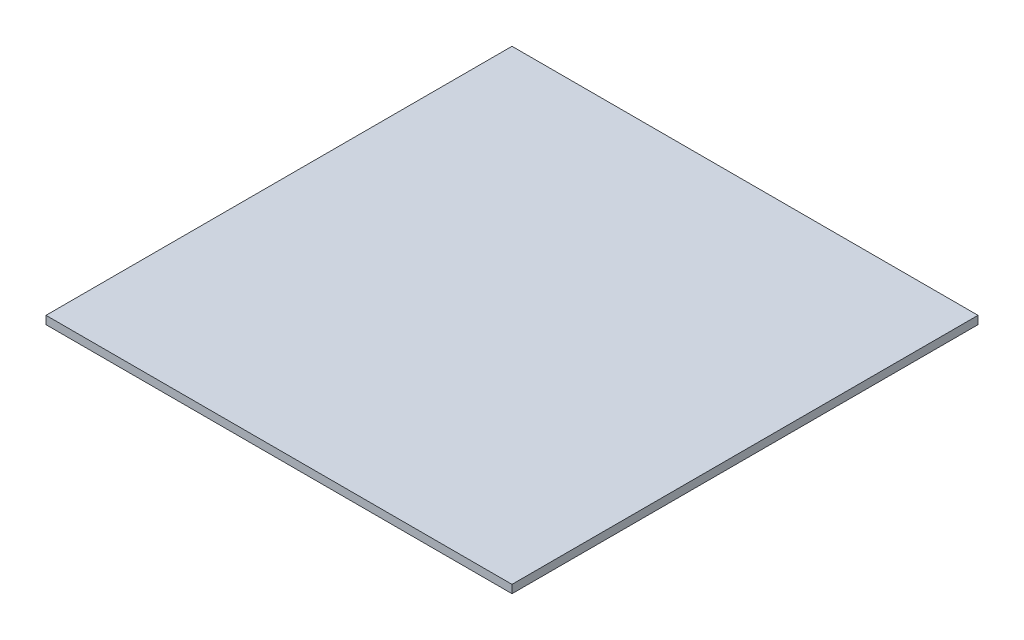
ISO-10303-21;
HEADER;
FILE_DESCRIPTION(('STEP AP214'),'2;1');
FILE_NAME('part.step','',(''),(''),'','','');
FILE_SCHEMA(('AUTOMOTIVE_DESIGN { 1 0 10303 214 1 1 1 1 }'));
ENDSEC;
DATA;
#1=APPLICATION_CONTEXT('core data for automotive mechanical design processes');
#2=APPLICATION_PROTOCOL_DEFINITION('international standard','automotive_design',2000,#1);
#3=PRODUCT_CONTEXT('',#1,'mechanical');
#4=PRODUCT('Part','Part','',(#3));
#5=PRODUCT_RELATED_PRODUCT_CATEGORY('part','',(#4));
#6=PRODUCT_DEFINITION_FORMATION('','',#4);
#7=PRODUCT_DEFINITION_CONTEXT('part definition',#1,'design');
#8=PRODUCT_DEFINITION('design','',#6,#7);
#9=PRODUCT_DEFINITION_SHAPE('','',#8);
#10=(LENGTH_UNIT() NAMED_UNIT(*) SI_UNIT(.MILLI.,.METRE.));
#11=(NAMED_UNIT(*) PLANE_ANGLE_UNIT() SI_UNIT($,.RADIAN.));
#12=(NAMED_UNIT(*) SI_UNIT($,.STERADIAN.) SOLID_ANGLE_UNIT());
#13=UNCERTAINTY_MEASURE_WITH_UNIT(LENGTH_MEASURE(1.E-05),#10,'distance_accuracy_value','');
#14=(GEOMETRIC_REPRESENTATION_CONTEXT(3) GLOBAL_UNCERTAINTY_ASSIGNED_CONTEXT((#13)) GLOBAL_UNIT_ASSIGNED_CONTEXT((#10,
#11,#12)) REPRESENTATION_CONTEXT('',''));
#15=CARTESIAN_POINT('',(0.,0.,0.));
#16=DIRECTION('',(0.,0.,1.));
#17=DIRECTION('',(1.,0.,0.));
#18=AXIS2_PLACEMENT_3D('',#15,#16,#17);
#19=CARTESIAN_POINT('',(-4300.,150.,4299.99999999997));
#20=DIRECTION('',(0.999999999999999,0.,0.));
#21=DIRECTION('',(0.,0.,-0.999999999999997));
#22=AXIS2_PLACEMENT_3D('',#19,#20,#21);
#23=PLANE('',#22);
#24=DIRECTION('',(0.,0.,0.999999999999997));
#25=VECTOR('',#24,1.);
#26=CARTESIAN_POINT('',(-4300.,-1.33226762955019E-12,4299.99999999998));
#27=LINE('',#26,#25);
#28=CARTESIAN_POINT('',(-4300.,-1.33226762955019E-12,-4300.));
#29=VERTEX_POINT('',#28);
#30=CARTESIAN_POINT('',(-4300.,-1.33226762955019E-12,4299.99999999998));
#31=VERTEX_POINT('',#30);
#32=EDGE_CURVE('E107',#29,#31,#27,.T.);
#33=ORIENTED_EDGE('',*,*,#32,.T.);
#34=DIRECTION('',(0.,-1.,0.));
#35=VECTOR('',#34,1.);
#36=CARTESIAN_POINT('',(-4300.,150.,4299.99999999997));
#37=LINE('',#36,#35);
#38=CARTESIAN_POINT('',(-4300.,150.,4299.99999999997));
#39=VERTEX_POINT('',#38);
#40=EDGE_CURVE('E11',#39,#31,#37,.T.);
#41=ORIENTED_EDGE('',*,*,#40,.F.);
#42=DIRECTION('',(0.,0.,0.999999999999997));
#43=VECTOR('',#42,1.);
#44=CARTESIAN_POINT('',(-4300.,150.,4299.99999999997));
#45=LINE('',#44,#43);
#46=CARTESIAN_POINT('',(-4300.,150.,-4300.));
#47=VERTEX_POINT('',#46);
#48=EDGE_CURVE('E90',#47,#39,#45,.T.);
#49=ORIENTED_EDGE('',*,*,#48,.F.);
#50=DIRECTION('',(0.,-1.,0.));
#51=VECTOR('',#50,1.);
#52=CARTESIAN_POINT('',(-4300.,150.,-4300.));
#53=LINE('',#52,#51);
#54=EDGE_CURVE('E103',#47,#29,#53,.T.);
#55=ORIENTED_EDGE('',*,*,#54,.T.);
#56=EDGE_LOOP('',(#33,#41,#49,#55));
#57=FACE_BOUND('',#56,.T.);
#58=ADVANCED_FACE('F38',(#57),#23,.F.);
#59=CARTESIAN_POINT('',(4299.99999999999,150.000000000001,4299.99999999997));
#60=DIRECTION('',(0.,0.,-0.999999999999999));
#61=DIRECTION('',(-1.,0.,0.));
#62=AXIS2_PLACEMENT_3D('',#59,#60,#61);
#63=PLANE('',#62);
#64=DIRECTION('',(1.,0.,0.));
#65=VECTOR('',#64,1.);
#66=CARTESIAN_POINT('',(4299.99999999999,1.33226762955019E-12,4299.99999999997));
#67=LINE('',#66,#65);
#68=CARTESIAN_POINT('',(4299.99999999999,1.33226762955019E-12,4299.99999999997));
#69=VERTEX_POINT('',#68);
#70=EDGE_CURVE('E95',#31,#69,#67,.T.);
#71=ORIENTED_EDGE('',*,*,#70,.T.);
#72=DIRECTION('',(0.,-1.,0.));
#73=VECTOR('',#72,1.);
#74=CARTESIAN_POINT('',(4299.99999999999,150.000000000001,4299.99999999997));
#75=LINE('',#74,#73);
#76=CARTESIAN_POINT('',(4299.99999999999,150.000000000001,4299.99999999997));
#77=VERTEX_POINT('',#76);
#78=EDGE_CURVE('E47',#77,#69,#75,.T.);
#79=ORIENTED_EDGE('',*,*,#78,.F.);
#80=DIRECTION('',(1.,0.,0.));
#81=VECTOR('',#80,1.);
#82=CARTESIAN_POINT('',(4299.99999999999,150.000000000001,4299.99999999997));
#83=LINE('',#82,#81);
#84=EDGE_CURVE('E85',#39,#77,#83,.T.);
#85=ORIENTED_EDGE('',*,*,#84,.F.);
#86=ORIENTED_EDGE('',*,*,#40,.T.);
#87=EDGE_LOOP('',(#71,#79,#85,#86));
#88=FACE_BOUND('',#87,.T.);
#89=ADVANCED_FACE('F94',(#88),#63,.F.);
#90=CARTESIAN_POINT('',(4299.99999999999,150.000000000001,4299.99999999997));
#91=DIRECTION('',(-0.999999999999999,0.,0.));
#92=DIRECTION('',(0.,0.,0.999999999999997));
#93=AXIS2_PLACEMENT_3D('',#90,#91,#92);
#94=PLANE('',#93);
#95=DIRECTION('',(0.,0.,-0.999999999999997));
#96=VECTOR('',#95,1.);
#97=CARTESIAN_POINT('',(4299.99999999999,1.33226762955019E-12,4299.99999999997));
#98=LINE('',#97,#96);
#99=CARTESIAN_POINT('',(4300.,-8.88178419700125E-13,-4300.));
#100=VERTEX_POINT('',#99);
#101=EDGE_CURVE('E72',#69,#100,#98,.T.);
#102=ORIENTED_EDGE('',*,*,#101,.T.);
#103=DIRECTION('',(0.,-1.,0.));
#104=VECTOR('',#103,1.);
#105=CARTESIAN_POINT('',(4300.,150.,-4300.));
#106=LINE('',#105,#104);
#107=CARTESIAN_POINT('',(4300.,150.,-4300.));
#108=VERTEX_POINT('',#107);
#109=EDGE_CURVE('E97',#108,#100,#106,.T.);
#110=ORIENTED_EDGE('',*,*,#109,.F.);
#111=DIRECTION('',(0.,0.,-0.999999999999997));
#112=VECTOR('',#111,1.);
#113=CARTESIAN_POINT('',(4299.99999999999,150.000000000001,4299.99999999997));
#114=LINE('',#113,#112);
#115=EDGE_CURVE('E88',#77,#108,#114,.T.);
#116=ORIENTED_EDGE('',*,*,#115,.F.);
#117=ORIENTED_EDGE('',*,*,#78,.T.);
#118=EDGE_LOOP('',(#102,#110,#116,#117));
#119=FACE_BOUND('',#118,.T.);
#120=ADVANCED_FACE('F98',(#119),#94,.F.);
#121=CARTESIAN_POINT('',(4300.,150.,-4300.));
#122=DIRECTION('',(0.,0.,0.999999999999997));
#123=DIRECTION('',(1.,0.,0.));
#124=AXIS2_PLACEMENT_3D('',#121,#122,#123);
#125=PLANE('',#124);
#126=DIRECTION('',(-1.,0.,0.));
#127=VECTOR('',#126,1.);
#128=CARTESIAN_POINT('',(4300.,-8.88178419700125E-13,-4300.));
#129=LINE('',#128,#127);
#130=EDGE_CURVE('E78',#100,#29,#129,.T.);
#131=ORIENTED_EDGE('',*,*,#130,.T.);
#132=ORIENTED_EDGE('',*,*,#54,.F.);
#133=DIRECTION('',(-1.,0.,0.));
#134=VECTOR('',#133,1.);
#135=CARTESIAN_POINT('',(4300.,150.,-4300.));
#136=LINE('',#135,#134);
#137=EDGE_CURVE('E55',#108,#47,#136,.T.);
#138=ORIENTED_EDGE('',*,*,#137,.F.);
#139=ORIENTED_EDGE('',*,*,#109,.T.);
#140=EDGE_LOOP('',(#131,#132,#138,#139));
#141=FACE_BOUND('',#140,.T.);
#142=ADVANCED_FACE('F121',(#141),#125,.F.);
#143=CARTESIAN_POINT('',(-3.60822483003176E-13,150.,4.02455846426619E-13));
#144=DIRECTION('',(0.,1.,0.));
#145=DIRECTION('',(0.,0.,0.999999999999997));
#146=AXIS2_PLACEMENT_3D('',#143,#144,#145);
#147=PLANE('',#146);
#148=ORIENTED_EDGE('',*,*,#48,.T.);
#149=ORIENTED_EDGE('',*,*,#84,.T.);
#150=ORIENTED_EDGE('',*,*,#115,.T.);
#151=ORIENTED_EDGE('',*,*,#137,.T.);
#152=EDGE_LOOP('',(#148,#149,#150,#151));
#153=FACE_BOUND('',#152,.T.);
#154=ADVANCED_FACE('F86',(#153),#147,.T.);
#155=CARTESIAN_POINT('',(0.,0.,0.));
#156=DIRECTION('',(0.,1.,0.));
#157=DIRECTION('',(0.,0.,0.999999999999997));
#158=AXIS2_PLACEMENT_3D('',#155,#156,#157);
#159=PLANE('',#158);
#160=ORIENTED_EDGE('',*,*,#32,.F.);
#161=ORIENTED_EDGE('',*,*,#130,.F.);
#162=ORIENTED_EDGE('',*,*,#101,.F.);
#163=ORIENTED_EDGE('',*,*,#70,.F.);
#164=EDGE_LOOP('',(#160,#161,#162,#163));
#165=FACE_BOUND('',#164,.T.);
#166=ADVANCED_FACE('F124',(#165),#159,.F.);
#167=CLOSED_SHELL('',(#58,#89,#120,#142,#154,#166));
#168=MANIFOLD_SOLID_BREP('B2',#167);
#169=ADVANCED_BREP_SHAPE_REPRESENTATION('',(#18,#168),#14);
#170=SHAPE_DEFINITION_REPRESENTATION(#9,#169);
ENDSEC;
END-ISO-10303-21;
